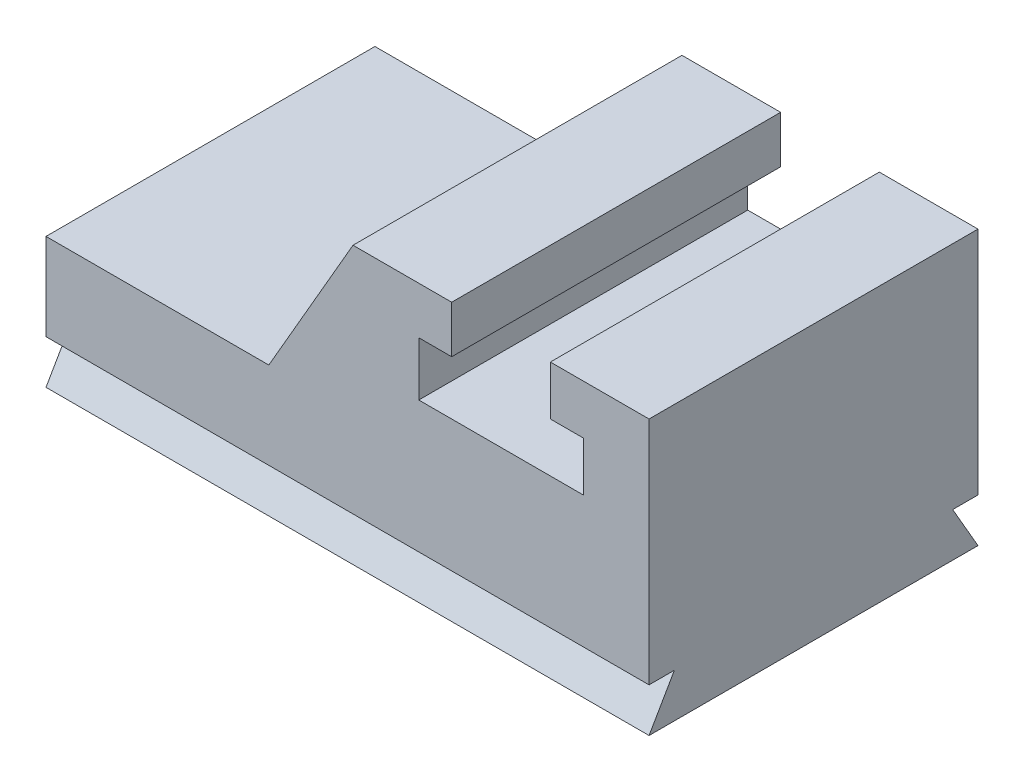
ISO-10303-21;
HEADER;
FILE_DESCRIPTION(('STEP AP214'),'2;1');
FILE_NAME('part.step','',(''),(''),'','','');
FILE_SCHEMA(('AUTOMOTIVE_DESIGN { 1 0 10303 214 1 1 1 1 }'));
ENDSEC;
DATA;
#1=APPLICATION_CONTEXT('core data for automotive mechanical design processes');
#2=APPLICATION_PROTOCOL_DEFINITION('international standard','automotive_design',2000,#1);
#3=PRODUCT_CONTEXT('',#1,'mechanical');
#4=PRODUCT('Part','Part','',(#3));
#5=PRODUCT_RELATED_PRODUCT_CATEGORY('part','',(#4));
#6=PRODUCT_DEFINITION_FORMATION('','',#4);
#7=PRODUCT_DEFINITION_CONTEXT('part definition',#1,'design');
#8=PRODUCT_DEFINITION('design','',#6,#7);
#9=PRODUCT_DEFINITION_SHAPE('','',#8);
#10=(LENGTH_UNIT() NAMED_UNIT(*) SI_UNIT(.MILLI.,.METRE.));
#11=(NAMED_UNIT(*) PLANE_ANGLE_UNIT() SI_UNIT($,.RADIAN.));
#12=(NAMED_UNIT(*) SI_UNIT($,.STERADIAN.) SOLID_ANGLE_UNIT());
#13=UNCERTAINTY_MEASURE_WITH_UNIT(LENGTH_MEASURE(1.E-05),#10,'distance_accuracy_value','');
#14=(GEOMETRIC_REPRESENTATION_CONTEXT(3) GLOBAL_UNCERTAINTY_ASSIGNED_CONTEXT((#13)) GLOBAL_UNIT_ASSIGNED_CONTEXT((#10,
#11,#12)) REPRESENTATION_CONTEXT('',''));
#15=CARTESIAN_POINT('',(0.,0.,0.));
#16=DIRECTION('',(0.,0.,1.));
#17=DIRECTION('',(1.,0.,0.));
#18=AXIS2_PLACEMENT_3D('',#15,#16,#17);
#19=CARTESIAN_POINT('',(0.,0.,60.));
#20=DIRECTION('',(0.,1.,0.));
#21=DIRECTION('',(0.,0.,1.));
#22=AXIS2_PLACEMENT_3D('',#19,#20,#21);
#23=PLANE('',#22);
#24=DIRECTION('',(-1.,0.,0.));
#25=VECTOR('',#24,1.);
#26=CARTESIAN_POINT('',(110.,0.,55.3811978464829));
#27=LINE('',#26,#25);
#28=CARTESIAN_POINT('',(110.,0.,55.3811978464829));
#29=VERTEX_POINT('',#28);
#30=CARTESIAN_POINT('',(0.,0.,55.3811978464829));
#31=VERTEX_POINT('',#30);
#32=EDGE_CURVE('E351',#29,#31,#27,.T.);
#33=ORIENTED_EDGE('',*,*,#32,.F.);
#34=DIRECTION('',(0.,0.,-1.));
#35=VECTOR('',#34,1.);
#36=CARTESIAN_POINT('',(110.,0.,60.));
#37=LINE('',#36,#35);
#38=CARTESIAN_POINT('',(110.,0.,60.));
#39=VERTEX_POINT('',#38);
#40=EDGE_CURVE('E270',#39,#29,#37,.T.);
#41=ORIENTED_EDGE('',*,*,#40,.F.);
#42=DIRECTION('',(1.,0.,0.));
#43=VECTOR('',#42,1.);
#44=CARTESIAN_POINT('',(0.,0.,60.));
#45=LINE('',#44,#43);
#46=CARTESIAN_POINT('',(0.,0.,60.));
#47=VERTEX_POINT('',#46);
#48=EDGE_CURVE('E312',#47,#39,#45,.T.);
#49=ORIENTED_EDGE('',*,*,#48,.F.);
#50=DIRECTION('',(0.,0.,-1.));
#51=VECTOR('',#50,1.);
#52=CARTESIAN_POINT('',(0.,0.,60.));
#53=LINE('',#52,#51);
#54=EDGE_CURVE('E49',#47,#31,#53,.T.);
#55=ORIENTED_EDGE('',*,*,#54,.T.);
#56=EDGE_LOOP('',(#33,#41,#49,#55));
#57=FACE_BOUND('',#56,.T.);
#58=ADVANCED_FACE('F40',(#57),#23,.F.);
#59=CARTESIAN_POINT('',(40.6406594732342,15.8454084473451,60.));
#60=DIRECTION('',(0.,-1.,0.));
#61=DIRECTION('',(1.,0.,0.));
#62=AXIS2_PLACEMENT_3D('',#59,#60,#61);
#63=PLANE('',#62);
#64=DIRECTION('',(-1.,0.,0.));
#65=VECTOR('',#64,1.);
#66=CARTESIAN_POINT('',(40.6406594732342,15.8454084473451,0.));
#67=LINE('',#66,#65);
#68=CARTESIAN_POINT('',(40.6406594732342,15.8454084473451,0.));
#69=VERTEX_POINT('',#68);
#70=CARTESIAN_POINT('',(0.,15.8454084473451,0.));
#71=VERTEX_POINT('',#70);
#72=EDGE_CURVE('E190',#69,#71,#67,.T.);
#73=ORIENTED_EDGE('',*,*,#72,.T.);
#74=DIRECTION('',(0.,0.,-1.));
#75=VECTOR('',#74,1.);
#76=CARTESIAN_POINT('',(0.,15.8454084473451,60.));
#77=LINE('',#76,#75);
#78=CARTESIAN_POINT('',(0.,15.8454084473451,60.));
#79=VERTEX_POINT('',#78);
#80=EDGE_CURVE('E11',#79,#71,#77,.T.);
#81=ORIENTED_EDGE('',*,*,#80,.F.);
#82=DIRECTION('',(-1.,0.,0.));
#83=VECTOR('',#82,1.);
#84=CARTESIAN_POINT('',(40.6406594732342,15.8454084473451,60.));
#85=LINE('',#84,#83);
#86=CARTESIAN_POINT('',(40.6406594732342,15.8454084473451,60.));
#87=VERTEX_POINT('',#86);
#88=EDGE_CURVE('E234',#87,#79,#85,.T.);
#89=ORIENTED_EDGE('',*,*,#88,.F.);
#90=DIRECTION('',(0.,0.,-1.));
#91=VECTOR('',#90,1.);
#92=CARTESIAN_POINT('',(40.6406594732342,15.8454084473451,60.));
#93=LINE('',#92,#91);
#94=EDGE_CURVE('E186',#87,#69,#93,.T.);
#95=ORIENTED_EDGE('',*,*,#94,.T.);
#96=EDGE_LOOP('',(#73,#81,#89,#95));
#97=FACE_BOUND('',#96,.T.);
#98=ADVANCED_FACE('F42',(#97),#63,.F.);
#99=CARTESIAN_POINT('',(0.,15.8454084473451,60.));
#100=DIRECTION('',(1.,0.,0.));
#101=DIRECTION('',(0.,1.,0.));
#102=AXIS2_PLACEMENT_3D('',#99,#100,#101);
#103=PLANE('',#102);
#104=DIRECTION('',(0.,-1.,0.));
#105=VECTOR('',#104,1.);
#106=CARTESIAN_POINT('',(0.,15.8454084473451,0.));
#107=LINE('',#106,#105);
#108=CARTESIAN_POINT('',(0.,0.,0.));
#109=VERTEX_POINT('',#108);
#110=EDGE_CURVE('E194',#71,#109,#107,.T.);
#111=ORIENTED_EDGE('',*,*,#110,.T.);
#112=CARTESIAN_POINT('',(0.,0.,4.61880215351706));
#113=VERTEX_POINT('',#112);
#114=EDGE_CURVE('E273',#113,#109,#53,.T.);
#115=ORIENTED_EDGE('',*,*,#114,.F.);
#116=DIRECTION('',(0.,-0.866025403784436,-0.500000000000004));
#117=VECTOR('',#116,1.);
#118=CARTESIAN_POINT('',(0.,0.,4.61880215351706));
#119=LINE('',#118,#117);
#120=CARTESIAN_POINT('',(0.,-8.,0.));
#121=VERTEX_POINT('',#120);
#122=EDGE_CURVE('E56',#113,#121,#119,.T.);
#123=ORIENTED_EDGE('',*,*,#122,.T.);
#124=DIRECTION('',(0.,0.,1.));
#125=VECTOR('',#124,1.);
#126=CARTESIAN_POINT('',(0.,-8.,0.));
#127=LINE('',#126,#125);
#128=CARTESIAN_POINT('',(0.,-8.,60.));
#129=VERTEX_POINT('',#128);
#130=EDGE_CURVE('E378',#121,#129,#127,.T.);
#131=ORIENTED_EDGE('',*,*,#130,.T.);
#132=DIRECTION('',(0.,0.866025403784436,-0.500000000000004));
#133=VECTOR('',#132,1.);
#134=CARTESIAN_POINT('',(0.,-8.,60.));
#135=LINE('',#134,#133);
#136=EDGE_CURVE('E386',#129,#31,#135,.T.);
#137=ORIENTED_EDGE('',*,*,#136,.T.);
#138=ORIENTED_EDGE('',*,*,#54,.F.);
#139=DIRECTION('',(0.,-1.,0.));
#140=VECTOR('',#139,1.);
#141=CARTESIAN_POINT('',(0.,15.8454084473451,60.));
#142=LINE('',#141,#140);
#143=EDGE_CURVE('E124',#79,#47,#142,.T.);
#144=ORIENTED_EDGE('',*,*,#143,.F.);
#145=ORIENTED_EDGE('',*,*,#80,.T.);
#146=EDGE_LOOP('',(#111,#115,#123,#131,#137,#138,#144,#145));
#147=FACE_BOUND('',#146,.T.);
#148=ADVANCED_FACE('F286',(#147),#103,.F.);
#149=CARTESIAN_POINT('',(110.,0.,4.61880215351706));
#150=VERTEX_POINT('',#149);
#151=CARTESIAN_POINT('',(110.,0.,0.));
#152=VERTEX_POINT('',#151);
#153=EDGE_CURVE('E269',#150,#152,#37,.T.);
#154=ORIENTED_EDGE('',*,*,#153,.F.);
#155=DIRECTION('',(-1.,0.,0.));
#156=VECTOR('',#155,1.);
#157=CARTESIAN_POINT('',(110.,0.,4.61880215351706));
#158=LINE('',#157,#156);
#159=EDGE_CURVE('E195',#150,#113,#158,.T.);
#160=ORIENTED_EDGE('',*,*,#159,.T.);
#161=ORIENTED_EDGE('',*,*,#114,.T.);
#162=DIRECTION('',(1.,0.,0.));
#163=VECTOR('',#162,1.);
#164=CARTESIAN_POINT('',(0.,0.,0.));
#165=LINE('',#164,#163);
#166=EDGE_CURVE('E199',#109,#152,#165,.T.);
#167=ORIENTED_EDGE('',*,*,#166,.T.);
#168=EDGE_LOOP('',(#154,#160,#161,#167));
#169=FACE_BOUND('',#168,.T.);
#170=ADVANCED_FACE('F283',(#169),#23,.F.);
#171=CARTESIAN_POINT('',(110.,0.,60.));
#172=DIRECTION('',(-1.,0.,0.));
#173=DIRECTION('',(0.,0.,1.));
#174=AXIS2_PLACEMENT_3D('',#171,#172,#173);
#175=PLANE('',#174);
#176=DIRECTION('',(0.,1.,0.));
#177=VECTOR('',#176,1.);
#178=CARTESIAN_POINT('',(110.,0.,0.));
#179=LINE('',#178,#177);
#180=CARTESIAN_POINT('',(110.,42.,0.));
#181=VERTEX_POINT('',#180);
#182=EDGE_CURVE('E203',#152,#181,#179,.T.);
#183=ORIENTED_EDGE('',*,*,#182,.T.);
#184=DIRECTION('',(0.,0.,-1.));
#185=VECTOR('',#184,1.);
#186=CARTESIAN_POINT('',(110.,42.,60.));
#187=LINE('',#186,#185);
#188=CARTESIAN_POINT('',(110.,42.,60.));
#189=VERTEX_POINT('',#188);
#190=EDGE_CURVE('E265',#189,#181,#187,.T.);
#191=ORIENTED_EDGE('',*,*,#190,.F.);
#192=DIRECTION('',(0.,1.,0.));
#193=VECTOR('',#192,1.);
#194=CARTESIAN_POINT('',(110.,0.,60.));
#195=LINE('',#194,#193);
#196=EDGE_CURVE('E306',#39,#189,#195,.T.);
#197=ORIENTED_EDGE('',*,*,#196,.F.);
#198=ORIENTED_EDGE('',*,*,#40,.T.);
#199=DIRECTION('',(0.,0.866025403784436,-0.500000000000004));
#200=VECTOR('',#199,1.);
#201=CARTESIAN_POINT('',(110.,-8.00000000000001,60.));
#202=LINE('',#201,#200);
#203=CARTESIAN_POINT('',(110.,-8.00000000000001,60.));
#204=VERTEX_POINT('',#203);
#205=EDGE_CURVE('E356',#204,#29,#202,.T.);
#206=ORIENTED_EDGE('',*,*,#205,.F.);
#207=DIRECTION('',(0.,0.,1.));
#208=VECTOR('',#207,1.);
#209=CARTESIAN_POINT('',(110.,-8.00000000000001,0.));
#210=LINE('',#209,#208);
#211=CARTESIAN_POINT('',(110.,-8.00000000000001,0.));
#212=VERTEX_POINT('',#211);
#213=EDGE_CURVE('E376',#212,#204,#210,.T.);
#214=ORIENTED_EDGE('',*,*,#213,.F.);
#215=DIRECTION('',(0.,-0.866025403784436,-0.500000000000004));
#216=VECTOR('',#215,1.);
#217=CARTESIAN_POINT('',(110.,0.,4.61880215351706));
#218=LINE('',#217,#216);
#219=EDGE_CURVE('E381',#150,#212,#218,.T.);
#220=ORIENTED_EDGE('',*,*,#219,.F.);
#221=ORIENTED_EDGE('',*,*,#153,.T.);
#222=EDGE_LOOP('',(#183,#191,#197,#198,#206,#214,#220,#221));
#223=FACE_BOUND('',#222,.T.);
#224=ADVANCED_FACE('F295',(#223),#175,.F.);
#225=CARTESIAN_POINT('',(110.,42.,60.));
#226=DIRECTION('',(0.,-1.,0.));
#227=DIRECTION('',(0.,0.,-1.));
#228=AXIS2_PLACEMENT_3D('',#225,#226,#227);
#229=PLANE('',#228);
#230=DIRECTION('',(-1.,0.,0.));
#231=VECTOR('',#230,1.);
#232=CARTESIAN_POINT('',(110.,42.,0.));
#233=LINE('',#232,#231);
#234=CARTESIAN_POINT('',(92.,42.,0.));
#235=VERTEX_POINT('',#234);
#236=EDGE_CURVE('E206',#181,#235,#233,.T.);
#237=ORIENTED_EDGE('',*,*,#236,.T.);
#238=DIRECTION('',(0.,0.,-1.));
#239=VECTOR('',#238,1.);
#240=CARTESIAN_POINT('',(92.,42.,60.));
#241=LINE('',#240,#239);
#242=CARTESIAN_POINT('',(92.,42.,60.));
#243=VERTEX_POINT('',#242);
#244=EDGE_CURVE('E261',#243,#235,#241,.T.);
#245=ORIENTED_EDGE('',*,*,#244,.F.);
#246=DIRECTION('',(-1.,0.,0.));
#247=VECTOR('',#246,1.);
#248=CARTESIAN_POINT('',(110.,42.,60.));
#249=LINE('',#248,#247);
#250=EDGE_CURVE('E302',#189,#243,#249,.T.);
#251=ORIENTED_EDGE('',*,*,#250,.F.);
#252=ORIENTED_EDGE('',*,*,#190,.T.);
#253=EDGE_LOOP('',(#237,#245,#251,#252));
#254=FACE_BOUND('',#253,.T.);
#255=ADVANCED_FACE('F300',(#254),#229,.F.);
#256=CARTESIAN_POINT('',(92.,42.,60.));
#257=DIRECTION('',(1.,0.,0.));
#258=DIRECTION('',(0.,0.,-1.));
#259=AXIS2_PLACEMENT_3D('',#256,#257,#258);
#260=PLANE('',#259);
#261=DIRECTION('',(0.,-1.,0.));
#262=VECTOR('',#261,1.);
#263=CARTESIAN_POINT('',(92.,42.,0.));
#264=LINE('',#263,#262);
#265=CARTESIAN_POINT('',(92.,33.,0.));
#266=VERTEX_POINT('',#265);
#267=EDGE_CURVE('E209',#235,#266,#264,.T.);
#268=ORIENTED_EDGE('',*,*,#267,.T.);
#269=DIRECTION('',(0.,0.,-1.));
#270=VECTOR('',#269,1.);
#271=CARTESIAN_POINT('',(92.,33.,60.));
#272=LINE('',#271,#270);
#273=CARTESIAN_POINT('',(92.,33.,60.));
#274=VERTEX_POINT('',#273);
#275=EDGE_CURVE('E257',#274,#266,#272,.T.);
#276=ORIENTED_EDGE('',*,*,#275,.F.);
#277=DIRECTION('',(0.,-1.,0.));
#278=VECTOR('',#277,1.);
#279=CARTESIAN_POINT('',(92.,42.,60.));
#280=LINE('',#279,#278);
#281=EDGE_CURVE('E305',#243,#274,#280,.T.);
#282=ORIENTED_EDGE('',*,*,#281,.F.);
#283=ORIENTED_EDGE('',*,*,#244,.T.);
#284=EDGE_LOOP('',(#268,#276,#282,#283));
#285=FACE_BOUND('',#284,.T.);
#286=ADVANCED_FACE('F437',(#285),#260,.F.);
#287=CARTESIAN_POINT('',(92.,33.,60.));
#288=DIRECTION('',(0.,1.,0.));
#289=DIRECTION('',(0.,0.,1.));
#290=AXIS2_PLACEMENT_3D('',#287,#288,#289);
#291=PLANE('',#290);
#292=DIRECTION('',(1.,0.,0.));
#293=VECTOR('',#292,1.);
#294=CARTESIAN_POINT('',(92.,33.,0.));
#295=LINE('',#294,#293);
#296=CARTESIAN_POINT('',(98.,33.,0.));
#297=VERTEX_POINT('',#296);
#298=EDGE_CURVE('E212',#266,#297,#295,.T.);
#299=ORIENTED_EDGE('',*,*,#298,.T.);
#300=DIRECTION('',(0.,0.,-1.));
#301=VECTOR('',#300,1.);
#302=CARTESIAN_POINT('',(98.,33.,60.));
#303=LINE('',#302,#301);
#304=CARTESIAN_POINT('',(98.,33.,60.));
#305=VERTEX_POINT('',#304);
#306=EDGE_CURVE('E253',#305,#297,#303,.T.);
#307=ORIENTED_EDGE('',*,*,#306,.F.);
#308=DIRECTION('',(1.,0.,0.));
#309=VECTOR('',#308,1.);
#310=CARTESIAN_POINT('',(92.,33.,60.));
#311=LINE('',#310,#309);
#312=EDGE_CURVE('E310',#274,#305,#311,.T.);
#313=ORIENTED_EDGE('',*,*,#312,.F.);
#314=ORIENTED_EDGE('',*,*,#275,.T.);
#315=EDGE_LOOP('',(#299,#307,#313,#314));
#316=FACE_BOUND('',#315,.T.);
#317=ADVANCED_FACE('F447',(#316),#291,.F.);
#318=CARTESIAN_POINT('',(98.,33.,60.));
#319=DIRECTION('',(1.,0.,0.));
#320=DIRECTION('',(0.,1.,0.));
#321=AXIS2_PLACEMENT_3D('',#318,#319,#320);
#322=PLANE('',#321);
#323=DIRECTION('',(0.,-1.,0.));
#324=VECTOR('',#323,1.);
#325=CARTESIAN_POINT('',(98.,33.,0.));
#326=LINE('',#325,#324);
#327=CARTESIAN_POINT('',(98.,24.,0.));
#328=VERTEX_POINT('',#327);
#329=EDGE_CURVE('E215',#297,#328,#326,.T.);
#330=ORIENTED_EDGE('',*,*,#329,.T.);
#331=DIRECTION('',(0.,0.,-1.));
#332=VECTOR('',#331,1.);
#333=CARTESIAN_POINT('',(98.,24.,60.));
#334=LINE('',#333,#332);
#335=CARTESIAN_POINT('',(98.,24.,60.));
#336=VERTEX_POINT('',#335);
#337=EDGE_CURVE('E249',#336,#328,#334,.T.);
#338=ORIENTED_EDGE('',*,*,#337,.F.);
#339=DIRECTION('',(0.,-1.,0.));
#340=VECTOR('',#339,1.);
#341=CARTESIAN_POINT('',(98.,33.,60.));
#342=LINE('',#341,#340);
#343=EDGE_CURVE('E318',#305,#336,#342,.T.);
#344=ORIENTED_EDGE('',*,*,#343,.F.);
#345=ORIENTED_EDGE('',*,*,#306,.T.);
#346=EDGE_LOOP('',(#330,#338,#344,#345));
#347=FACE_BOUND('',#346,.T.);
#348=ADVANCED_FACE('F457',(#347),#322,.F.);
#349=CARTESIAN_POINT('',(98.,24.,60.));
#350=DIRECTION('',(0.,-1.,0.));
#351=DIRECTION('',(1.,0.,0.));
#352=AXIS2_PLACEMENT_3D('',#349,#350,#351);
#353=PLANE('',#352);
#354=DIRECTION('',(-1.,0.,0.));
#355=VECTOR('',#354,1.);
#356=CARTESIAN_POINT('',(98.,24.,0.));
#357=LINE('',#356,#355);
#358=CARTESIAN_POINT('',(68.,24.,0.));
#359=VERTEX_POINT('',#358);
#360=EDGE_CURVE('E218',#328,#359,#357,.T.);
#361=ORIENTED_EDGE('',*,*,#360,.T.);
#362=DIRECTION('',(0.,0.,-1.));
#363=VECTOR('',#362,1.);
#364=CARTESIAN_POINT('',(68.,24.,60.));
#365=LINE('',#364,#363);
#366=CARTESIAN_POINT('',(68.,24.,60.));
#367=VERTEX_POINT('',#366);
#368=EDGE_CURVE('E245',#367,#359,#365,.T.);
#369=ORIENTED_EDGE('',*,*,#368,.F.);
#370=DIRECTION('',(-1.,0.,0.));
#371=VECTOR('',#370,1.);
#372=CARTESIAN_POINT('',(98.,24.,60.));
#373=LINE('',#372,#371);
#374=EDGE_CURVE('E321',#336,#367,#373,.T.);
#375=ORIENTED_EDGE('',*,*,#374,.F.);
#376=ORIENTED_EDGE('',*,*,#337,.T.);
#377=EDGE_LOOP('',(#361,#369,#375,#376));
#378=FACE_BOUND('',#377,.T.);
#379=ADVANCED_FACE('F467',(#378),#353,.F.);
#380=CARTESIAN_POINT('',(68.,24.,60.));
#381=DIRECTION('',(-1.,0.,0.));
#382=DIRECTION('',(0.,-1.,0.));
#383=AXIS2_PLACEMENT_3D('',#380,#381,#382);
#384=PLANE('',#383);
#385=DIRECTION('',(0.,1.,0.));
#386=VECTOR('',#385,1.);
#387=CARTESIAN_POINT('',(68.,24.,0.));
#388=LINE('',#387,#386);
#389=CARTESIAN_POINT('',(68.,33.8347386172007,0.));
#390=VERTEX_POINT('',#389);
#391=EDGE_CURVE('E221',#359,#390,#388,.T.);
#392=ORIENTED_EDGE('',*,*,#391,.T.);
#393=DIRECTION('',(0.,0.,-1.));
#394=VECTOR('',#393,1.);
#395=CARTESIAN_POINT('',(68.,33.8347386172007,60.));
#396=LINE('',#395,#394);
#397=CARTESIAN_POINT('',(68.,33.8347386172007,60.));
#398=VERTEX_POINT('',#397);
#399=EDGE_CURVE('E241',#398,#390,#396,.T.);
#400=ORIENTED_EDGE('',*,*,#399,.F.);
#401=DIRECTION('',(0.,1.,0.));
#402=VECTOR('',#401,1.);
#403=CARTESIAN_POINT('',(68.,24.,60.));
#404=LINE('',#403,#402);
#405=EDGE_CURVE('E324',#367,#398,#404,.T.);
#406=ORIENTED_EDGE('',*,*,#405,.F.);
#407=ORIENTED_EDGE('',*,*,#368,.T.);
#408=EDGE_LOOP('',(#392,#400,#406,#407));
#409=FACE_BOUND('',#408,.T.);
#410=ADVANCED_FACE('F332',(#409),#384,.F.);
#411=CARTESIAN_POINT('',(68.,33.8347386172007,60.));
#412=DIRECTION('',(0.,1.,0.));
#413=DIRECTION('',(0.,0.,1.));
#414=AXIS2_PLACEMENT_3D('',#411,#412,#413);
#415=PLANE('',#414);
#416=DIRECTION('',(1.,0.,0.));
#417=VECTOR('',#416,1.);
#418=CARTESIAN_POINT('',(68.,33.8347386172007,0.));
#419=LINE('',#418,#417);
#420=CARTESIAN_POINT('',(74.,33.8347386172007,0.));
#421=VERTEX_POINT('',#420);
#422=EDGE_CURVE('E224',#390,#421,#419,.T.);
#423=ORIENTED_EDGE('',*,*,#422,.T.);
#424=DIRECTION('',(0.,0.,-1.));
#425=VECTOR('',#424,1.);
#426=CARTESIAN_POINT('',(74.,33.8347386172007,60.));
#427=LINE('',#426,#425);
#428=CARTESIAN_POINT('',(74.,33.8347386172007,60.));
#429=VERTEX_POINT('',#428);
#430=EDGE_CURVE('E179',#429,#421,#427,.T.);
#431=ORIENTED_EDGE('',*,*,#430,.F.);
#432=DIRECTION('',(1.,0.,0.));
#433=VECTOR('',#432,1.);
#434=CARTESIAN_POINT('',(68.,33.8347386172007,60.));
#435=LINE('',#434,#433);
#436=EDGE_CURVE('E165',#398,#429,#435,.T.);
#437=ORIENTED_EDGE('',*,*,#436,.F.);
#438=ORIENTED_EDGE('',*,*,#399,.T.);
#439=EDGE_LOOP('',(#423,#431,#437,#438));
#440=FACE_BOUND('',#439,.T.);
#441=ADVANCED_FACE('F336',(#440),#415,.F.);
#442=CARTESIAN_POINT('',(74.,33.8347386172007,60.));
#443=DIRECTION('',(-1.,0.,0.));
#444=DIRECTION('',(0.,0.,1.));
#445=AXIS2_PLACEMENT_3D('',#442,#443,#444);
#446=PLANE('',#445);
#447=DIRECTION('',(0.,1.,0.));
#448=VECTOR('',#447,1.);
#449=CARTESIAN_POINT('',(74.,33.8347386172007,0.));
#450=LINE('',#449,#448);
#451=CARTESIAN_POINT('',(74.,42.4485666104553,0.));
#452=VERTEX_POINT('',#451);
#453=EDGE_CURVE('E175',#421,#452,#450,.T.);
#454=ORIENTED_EDGE('',*,*,#453,.T.);
#455=DIRECTION('',(0.,0.,-1.));
#456=VECTOR('',#455,1.);
#457=CARTESIAN_POINT('',(74.,42.4485666104553,60.));
#458=LINE('',#457,#456);
#459=CARTESIAN_POINT('',(74.,42.4485666104553,60.));
#460=VERTEX_POINT('',#459);
#461=EDGE_CURVE('E172',#460,#452,#458,.T.);
#462=ORIENTED_EDGE('',*,*,#461,.F.);
#463=DIRECTION('',(0.,1.,0.));
#464=VECTOR('',#463,1.);
#465=CARTESIAN_POINT('',(74.,33.8347386172007,60.));
#466=LINE('',#465,#464);
#467=EDGE_CURVE('E158',#429,#460,#466,.T.);
#468=ORIENTED_EDGE('',*,*,#467,.F.);
#469=ORIENTED_EDGE('',*,*,#430,.T.);
#470=EDGE_LOOP('',(#454,#462,#468,#469));
#471=FACE_BOUND('',#470,.T.);
#472=ADVANCED_FACE('F173',(#471),#446,.F.);
#473=CARTESIAN_POINT('',(74.,42.4485666104553,60.));
#474=DIRECTION('',(0.,-1.,0.));
#475=DIRECTION('',(0.,0.,-1.));
#476=AXIS2_PLACEMENT_3D('',#473,#474,#475);
#477=PLANE('',#476);
#478=DIRECTION('',(-1.,0.,0.));
#479=VECTOR('',#478,1.);
#480=CARTESIAN_POINT('',(74.,42.4485666104553,0.));
#481=LINE('',#480,#479);
#482=CARTESIAN_POINT('',(56.,42.4485666104553,0.));
#483=VERTEX_POINT('',#482);
#484=EDGE_CURVE('E229',#452,#483,#481,.T.);
#485=ORIENTED_EDGE('',*,*,#484,.T.);
#486=DIRECTION('',(0.,0.,-1.));
#487=VECTOR('',#486,1.);
#488=CARTESIAN_POINT('',(56.,42.4485666104553,60.));
#489=LINE('',#488,#487);
#490=CARTESIAN_POINT('',(56.,42.4485666104553,60.));
#491=VERTEX_POINT('',#490);
#492=EDGE_CURVE('E180',#491,#483,#489,.T.);
#493=ORIENTED_EDGE('',*,*,#492,.F.);
#494=DIRECTION('',(-1.,0.,0.));
#495=VECTOR('',#494,1.);
#496=CARTESIAN_POINT('',(74.,42.4485666104553,60.));
#497=LINE('',#496,#495);
#498=EDGE_CURVE('E162',#460,#491,#497,.T.);
#499=ORIENTED_EDGE('',*,*,#498,.F.);
#500=ORIENTED_EDGE('',*,*,#461,.T.);
#501=EDGE_LOOP('',(#485,#493,#499,#500));
#502=FACE_BOUND('',#501,.T.);
#503=ADVANCED_FACE('F182',(#502),#477,.F.);
#504=CARTESIAN_POINT('',(56.,42.4485666104553,60.));
#505=DIRECTION('',(0.86602540378444,-0.499999999999998,0.));
#506=DIRECTION('',(0.499999999999998,0.86602540378444,0.));
#507=AXIS2_PLACEMENT_3D('',#504,#505,#506);
#508=PLANE('',#507);
#509=DIRECTION('',(-0.499999999999998,-0.86602540378444,0.));
#510=VECTOR('',#509,1.);
#511=CARTESIAN_POINT('',(56.,42.4485666104553,0.));
#512=LINE('',#511,#510);
#513=EDGE_CURVE('E116',#483,#69,#512,.T.);
#514=ORIENTED_EDGE('',*,*,#513,.T.);
#515=ORIENTED_EDGE('',*,*,#94,.F.);
#516=DIRECTION('',(-0.499999999999998,-0.86602540378444,0.));
#517=VECTOR('',#516,1.);
#518=CARTESIAN_POINT('',(56.,42.4485666104553,60.));
#519=LINE('',#518,#517);
#520=EDGE_CURVE('E65',#491,#87,#519,.T.);
#521=ORIENTED_EDGE('',*,*,#520,.F.);
#522=ORIENTED_EDGE('',*,*,#492,.T.);
#523=EDGE_LOOP('',(#514,#515,#521,#522));
#524=FACE_BOUND('',#523,.T.);
#525=ADVANCED_FACE('F337',(#524),#508,.F.);
#526=CARTESIAN_POINT('',(0.,0.,60.));
#527=DIRECTION('',(0.,0.,1.));
#528=DIRECTION('',(1.,0.,0.));
#529=AXIS2_PLACEMENT_3D('',#526,#527,#528);
#530=PLANE('',#529);
#531=ORIENTED_EDGE('',*,*,#88,.T.);
#532=ORIENTED_EDGE('',*,*,#143,.T.);
#533=ORIENTED_EDGE('',*,*,#48,.T.);
#534=ORIENTED_EDGE('',*,*,#196,.T.);
#535=ORIENTED_EDGE('',*,*,#250,.T.);
#536=ORIENTED_EDGE('',*,*,#281,.T.);
#537=ORIENTED_EDGE('',*,*,#312,.T.);
#538=ORIENTED_EDGE('',*,*,#343,.T.);
#539=ORIENTED_EDGE('',*,*,#374,.T.);
#540=ORIENTED_EDGE('',*,*,#405,.T.);
#541=ORIENTED_EDGE('',*,*,#436,.T.);
#542=ORIENTED_EDGE('',*,*,#467,.T.);
#543=ORIENTED_EDGE('',*,*,#498,.T.);
#544=ORIENTED_EDGE('',*,*,#520,.T.);
#545=EDGE_LOOP('',(#531,#532,#533,#534,#535,#536,#537,#538,#539,#540,#541,#542,#543,#544));
#546=FACE_BOUND('',#545,.T.);
#547=ADVANCED_FACE('F160',(#546),#530,.T.);
#548=CARTESIAN_POINT('',(0.,0.,0.));
#549=DIRECTION('',(0.,0.,1.));
#550=DIRECTION('',(1.,0.,0.));
#551=AXIS2_PLACEMENT_3D('',#548,#549,#550);
#552=PLANE('',#551);
#553=ORIENTED_EDGE('',*,*,#72,.F.);
#554=ORIENTED_EDGE('',*,*,#513,.F.);
#555=ORIENTED_EDGE('',*,*,#484,.F.);
#556=ORIENTED_EDGE('',*,*,#453,.F.);
#557=ORIENTED_EDGE('',*,*,#422,.F.);
#558=ORIENTED_EDGE('',*,*,#391,.F.);
#559=ORIENTED_EDGE('',*,*,#360,.F.);
#560=ORIENTED_EDGE('',*,*,#329,.F.);
#561=ORIENTED_EDGE('',*,*,#298,.F.);
#562=ORIENTED_EDGE('',*,*,#267,.F.);
#563=ORIENTED_EDGE('',*,*,#236,.F.);
#564=ORIENTED_EDGE('',*,*,#182,.F.);
#565=ORIENTED_EDGE('',*,*,#166,.F.);
#566=ORIENTED_EDGE('',*,*,#110,.F.);
#567=EDGE_LOOP('',(#553,#554,#555,#556,#557,#558,#559,#560,#561,#562,#563,#564,#565,#566));
#568=FACE_BOUND('',#567,.T.);
#569=ADVANCED_FACE('F290',(#568),#552,.F.);
#570=CARTESIAN_POINT('',(110.,0.,4.61880215351706));
#571=DIRECTION('',(0.,0.500000000000004,-0.866025403784436));
#572=DIRECTION('',(0.,0.866025403784436,0.500000000000004));
#573=AXIS2_PLACEMENT_3D('',#570,#571,#572);
#574=PLANE('',#573);
#575=ORIENTED_EDGE('',*,*,#122,.F.);
#576=ORIENTED_EDGE('',*,*,#159,.F.);
#577=ORIENTED_EDGE('',*,*,#219,.T.);
#578=DIRECTION('',(-1.,0.,0.));
#579=VECTOR('',#578,1.);
#580=CARTESIAN_POINT('',(110.,-8.00000000000001,0.));
#581=LINE('',#580,#579);
#582=EDGE_CURVE('E345',#212,#121,#581,.T.);
#583=ORIENTED_EDGE('',*,*,#582,.T.);
#584=EDGE_LOOP('',(#575,#576,#577,#583));
#585=FACE_BOUND('',#584,.T.);
#586=ADVANCED_FACE('F384',(#585),#574,.T.);
#587=CARTESIAN_POINT('',(110.,-8.00000000000001,60.));
#588=DIRECTION('',(0.,0.500000000000004,0.866025403784436));
#589=DIRECTION('',(0.,-0.866025403784436,0.500000000000004));
#590=AXIS2_PLACEMENT_3D('',#587,#588,#589);
#591=PLANE('',#590);
#592=ORIENTED_EDGE('',*,*,#136,.F.);
#593=DIRECTION('',(-1.,0.,0.));
#594=VECTOR('',#593,1.);
#595=CARTESIAN_POINT('',(110.,-8.00000000000001,60.));
#596=LINE('',#595,#594);
#597=EDGE_CURVE('E371',#204,#129,#596,.T.);
#598=ORIENTED_EDGE('',*,*,#597,.F.);
#599=ORIENTED_EDGE('',*,*,#205,.T.);
#600=ORIENTED_EDGE('',*,*,#32,.T.);
#601=EDGE_LOOP('',(#592,#598,#599,#600));
#602=FACE_BOUND('',#601,.T.);
#603=ADVANCED_FACE('F401',(#602),#591,.T.);
#604=CARTESIAN_POINT('',(110.,-8.00000000000001,0.));
#605=DIRECTION('',(0.,-1.,0.));
#606=DIRECTION('',(1.,0.,0.));
#607=AXIS2_PLACEMENT_3D('',#604,#605,#606);
#608=PLANE('',#607);
#609=ORIENTED_EDGE('',*,*,#130,.F.);
#610=ORIENTED_EDGE('',*,*,#582,.F.);
#611=ORIENTED_EDGE('',*,*,#213,.T.);
#612=ORIENTED_EDGE('',*,*,#597,.T.);
#613=EDGE_LOOP('',(#609,#610,#611,#612));
#614=FACE_BOUND('',#613,.T.);
#615=ADVANCED_FACE('F375',(#614),#608,.T.);
#616=CLOSED_SHELL('',(#58,#98,#148,#170,#224,#255,#286,#317,#348,#379,#410,#441,#472,#503,#525,
#547,#569,#586,#603,#615));
#617=MANIFOLD_SOLID_BREP('B2',#616);
#618=ADVANCED_BREP_SHAPE_REPRESENTATION('',(#18,#617),#14);
#619=SHAPE_DEFINITION_REPRESENTATION(#9,#618);
ENDSEC;
END-ISO-10303-21;
